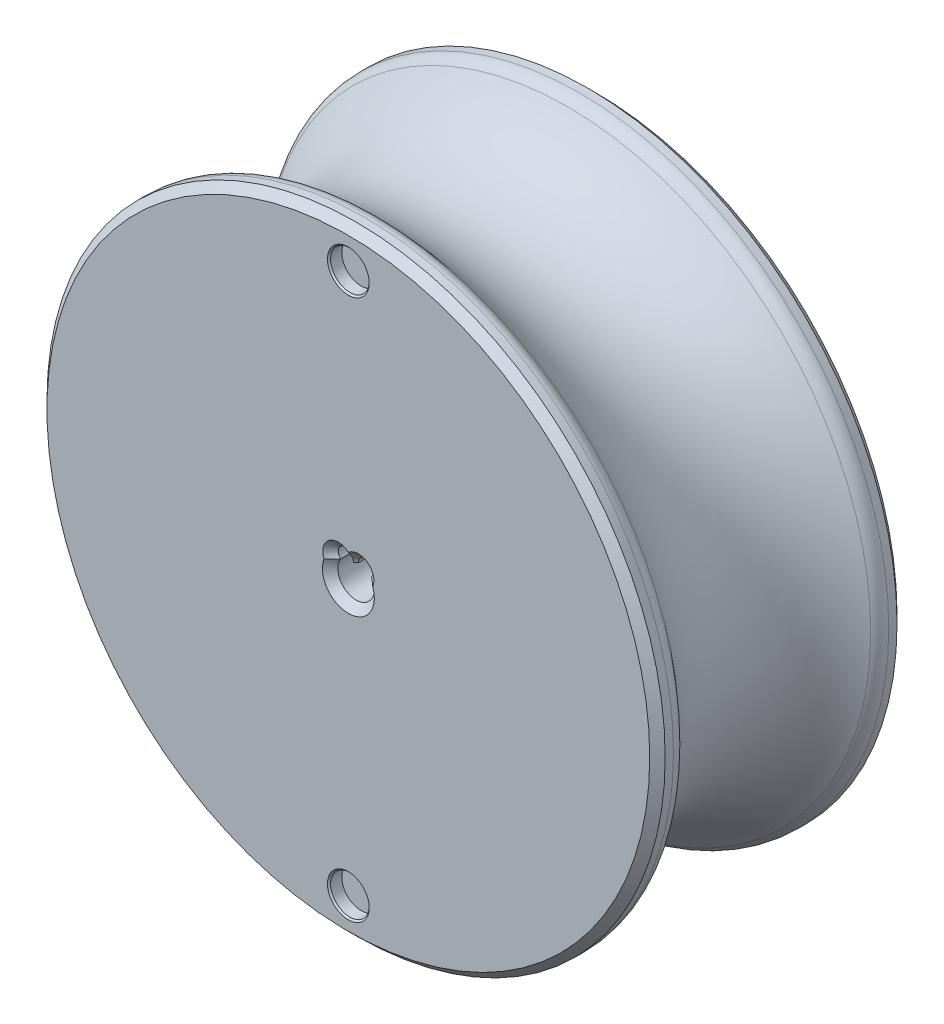
ISO-10303-21;
HEADER;
FILE_DESCRIPTION(('STEP AP214'),'2;1');
FILE_NAME('part.step','',(''),(''),'','','');
FILE_SCHEMA(('AUTOMOTIVE_DESIGN { 1 0 10303 214 1 1 1 1 }'));
ENDSEC;
DATA;
#1=APPLICATION_CONTEXT('core data for automotive mechanical design processes');
#2=APPLICATION_PROTOCOL_DEFINITION('international standard','automotive_design',2000,#1);
#3=PRODUCT_CONTEXT('',#1,'mechanical');
#4=PRODUCT('Part','Part','',(#3));
#5=PRODUCT_RELATED_PRODUCT_CATEGORY('part','',(#4));
#6=PRODUCT_DEFINITION_FORMATION('','',#4);
#7=PRODUCT_DEFINITION_CONTEXT('part definition',#1,'design');
#8=PRODUCT_DEFINITION('design','',#6,#7);
#9=PRODUCT_DEFINITION_SHAPE('','',#8);
#10=(LENGTH_UNIT() NAMED_UNIT(*) SI_UNIT(.MILLI.,.METRE.));
#11=(NAMED_UNIT(*) PLANE_ANGLE_UNIT() SI_UNIT($,.RADIAN.));
#12=(NAMED_UNIT(*) SI_UNIT($,.STERADIAN.) SOLID_ANGLE_UNIT());
#13=UNCERTAINTY_MEASURE_WITH_UNIT(LENGTH_MEASURE(1.E-05),#10,'distance_accuracy_value','');
#14=(GEOMETRIC_REPRESENTATION_CONTEXT(3) GLOBAL_UNCERTAINTY_ASSIGNED_CONTEXT((#13)) GLOBAL_UNIT_ASSIGNED_CONTEXT((#10,
#11,#12)) REPRESENTATION_CONTEXT('',''));
#15=CARTESIAN_POINT('',(0.,0.,0.));
#16=DIRECTION('',(0.,0.,1.));
#17=DIRECTION('',(1.,0.,0.));
#18=AXIS2_PLACEMENT_3D('',#15,#16,#17);
#19=CARTESIAN_POINT('',(0.,0.,20.32));
#20=DIRECTION('',(0.,0.,-1.));
#21=DIRECTION('',(-1.,0.,0.));
#22=AXIS2_PLACEMENT_3D('',#19,#20,#21);
#23=CYLINDRICAL_SURFACE('',#22,50.8);
#24=CARTESIAN_POINT('',(0.,0.,19.05));
#25=DIRECTION('',(0.,0.,1.));
#26=DIRECTION('',(1.,0.,0.));
#27=AXIS2_PLACEMENT_3D('',#24,#25,#26);
#28=CIRCLE('',#27,50.8);
#29=CARTESIAN_POINT('',(50.8,0.,19.05));
#30=VERTEX_POINT('',#29);
#31=EDGE_CURVE('E193',#30,#30,#28,.F.);
#32=ORIENTED_EDGE('',*,*,#31,.T.);
#33=EDGE_LOOP('',(#32));
#34=FACE_BOUND('',#33,.T.);
#35=CARTESIAN_POINT('',(0.,0.,17.6887167426018));
#36=DIRECTION('',(0.,0.,-1.));
#37=DIRECTION('',(-1.,0.,0.));
#38=AXIS2_PLACEMENT_3D('',#35,#36,#37);
#39=CIRCLE('',#38,50.8);
#40=CARTESIAN_POINT('',(-50.8,0.,17.6887167426018));
#41=VERTEX_POINT('',#40);
#42=EDGE_CURVE('E156',#41,#41,#39,.F.);
#43=ORIENTED_EDGE('',*,*,#42,.T.);
#44=EDGE_LOOP('',(#43));
#45=FACE_BOUND('',#44,.T.);
#46=ADVANCED_FACE('F49',(#34,#45),#23,.T.);
#47=CARTESIAN_POINT('',(0.,0.,20.32));
#48=DIRECTION('',(0.,0.,1.));
#49=DIRECTION('',(1.,0.,0.));
#50=AXIS2_PLACEMENT_3D('',#47,#48,#49);
#51=PLANE('',#50);
#52=CARTESIAN_POINT('',(0.,-44.45,20.32));
#53=DIRECTION('',(0.,0.,1.));
#54=DIRECTION('',(1.,0.,0.));
#55=AXIS2_PLACEMENT_3D('',#52,#53,#54);
#56=CIRCLE('',#55,3.42900000000002);
#57=CARTESIAN_POINT('',(3.42900000000002,-44.45,20.32));
#58=VERTEX_POINT('',#57);
#59=EDGE_CURVE('E246',#58,#58,#56,.F.);
#60=ORIENTED_EDGE('',*,*,#59,.T.);
#61=EDGE_LOOP('',(#60));
#62=FACE_BOUND('',#61,.T.);
#63=CARTESIAN_POINT('',(0.,44.45,20.32));
#64=DIRECTION('',(0.,0.,1.));
#65=DIRECTION('',(1.,0.,0.));
#66=AXIS2_PLACEMENT_3D('',#63,#64,#65);
#67=CIRCLE('',#66,3.42899999999999);
#68=CARTESIAN_POINT('',(3.42899999999999,44.45,20.32));
#69=VERTEX_POINT('',#68);
#70=EDGE_CURVE('E242',#69,#69,#67,.F.);
#71=ORIENTED_EDGE('',*,*,#70,.T.);
#72=EDGE_LOOP('',(#71));
#73=FACE_BOUND('',#72,.T.);
#74=CARTESIAN_POINT('',(-1.6583123951777,2.5,20.32));
#75=DIRECTION('',(0.,0.,1.));
#76=DIRECTION('',(1.,0.,0.));
#77=AXIS2_PLACEMENT_3D('',#74,#75,#76);
#78=CIRCLE('',#77,2.54000000000004);
#79=CARTESIAN_POINT('',(-3.99566835496328,1.5058334559789,20.32));
#80=VERTEX_POINT('',#79);
#81=CARTESIAN_POINT('',(0.,4.42395426141065,20.32));
#82=VERTEX_POINT('',#81);
#83=EDGE_CURVE('E74',#80,#82,#78,.F.);
#84=ORIENTED_EDGE('',*,*,#83,.T.);
#85=CARTESIAN_POINT('',(1.6583123951777,2.5,20.32));
#86=DIRECTION('',(0.,0.,1.));
#87=DIRECTION('',(1.,0.,0.));
#88=AXIS2_PLACEMENT_3D('',#85,#86,#87);
#89=CIRCLE('',#88,2.54000000000004);
#90=CARTESIAN_POINT('',(3.99566835496328,1.5058334559789,20.32));
#91=VERTEX_POINT('',#90);
#92=EDGE_CURVE('E178',#82,#91,#89,.F.);
#93=ORIENTED_EDGE('',*,*,#92,.T.);
#94=CARTESIAN_POINT('',(0.,0.,20.32));
#95=DIRECTION('',(0.,0.,1.));
#96=DIRECTION('',(1.,0.,0.));
#97=AXIS2_PLACEMENT_3D('',#94,#95,#96);
#98=CIRCLE('',#97,4.27000000000004);
#99=EDGE_CURVE('E173',#91,#80,#98,.F.);
#100=ORIENTED_EDGE('',*,*,#99,.T.);
#101=EDGE_LOOP('',(#84,#93,#100));
#102=FACE_BOUND('',#101,.T.);
#103=CARTESIAN_POINT('',(0.,0.,20.32));
#104=DIRECTION('',(0.,0.,1.));
#105=DIRECTION('',(1.,0.,0.));
#106=AXIS2_PLACEMENT_3D('',#103,#104,#105);
#107=CIRCLE('',#106,49.53);
#108=CARTESIAN_POINT('',(49.53,0.,20.32));
#109=VERTEX_POINT('',#108);
#110=EDGE_CURVE('E169',#109,#109,#107,.T.);
#111=ORIENTED_EDGE('',*,*,#110,.T.);
#112=EDGE_LOOP('',(#111));
#113=FACE_BOUND('',#112,.T.);
#114=ADVANCED_FACE('F289',(#62,#73,#102,#113),#51,.T.);
#115=CARTESIAN_POINT('',(0.,0.,6.32));
#116=DIRECTION('',(0.,0.,1.));
#117=DIRECTION('',(1.,0.,0.));
#118=AXIS2_PLACEMENT_3D('',#115,#116,#117);
#119=CYLINDRICAL_SURFACE('',#118,3.);
#120=DIRECTION('',(0.,0.,1.));
#121=VECTOR('',#120,1.);
#122=CARTESIAN_POINT('',(-2.54407192027579,1.58987360015325,13.32));
#123=LINE('',#122,#121);
#124=CARTESIAN_POINT('',(-2.54407192027579,1.58987360015325,6.32));
#125=VERTEX_POINT('',#124);
#126=CARTESIAN_POINT('',(-2.54407192027579,1.58987360015325,19.05));
#127=VERTEX_POINT('',#126);
#128=EDGE_CURVE('E136',#125,#127,#123,.T.);
#129=ORIENTED_EDGE('',*,*,#128,.T.);
#130=CARTESIAN_POINT('',(0.,0.,19.05));
#131=DIRECTION('',(0.,0.,1.));
#132=DIRECTION('',(1.,0.,0.));
#133=AXIS2_PLACEMENT_3D('',#130,#131,#132);
#134=CIRCLE('',#133,3.);
#135=CARTESIAN_POINT('',(2.54407192027579,1.58987360015325,19.05));
#136=VERTEX_POINT('',#135);
#137=EDGE_CURVE('E112',#127,#136,#134,.T.);
#138=ORIENTED_EDGE('',*,*,#137,.T.);
#139=DIRECTION('',(0.,0.,1.));
#140=VECTOR('',#139,1.);
#141=CARTESIAN_POINT('',(2.54407192027579,1.58987360015325,13.32));
#142=LINE('',#141,#140);
#143=CARTESIAN_POINT('',(2.54407192027579,1.58987360015325,6.32));
#144=VERTEX_POINT('',#143);
#145=EDGE_CURVE('E106',#136,#144,#142,.F.);
#146=ORIENTED_EDGE('',*,*,#145,.T.);
#147=CARTESIAN_POINT('',(0.,0.,6.32));
#148=DIRECTION('',(0.,0.,1.));
#149=DIRECTION('',(1.,0.,0.));
#150=AXIS2_PLACEMENT_3D('',#147,#148,#149);
#151=CIRCLE('',#150,3.);
#152=EDGE_CURVE('E110',#125,#144,#151,.T.);
#153=ORIENTED_EDGE('',*,*,#152,.F.);
#154=EDGE_LOOP('',(#129,#138,#146,#153));
#155=FACE_BOUND('',#154,.T.);
#156=ADVANCED_FACE('F108',(#155),#119,.F.);
#157=CARTESIAN_POINT('',(-1.6583123951777,2.5,6.32));
#158=DIRECTION('',(0.,1.,0.));
#159=DIRECTION('',(0.,0.,1.));
#160=AXIS2_PLACEMENT_3D('',#157,#158,#159);
#161=PLANE('',#160);
#162=DIRECTION('',(0.,0.,1.));
#163=VECTOR('',#162,1.);
#164=CARTESIAN_POINT('',(0.3883123951777,2.5,6.32));
#165=LINE('',#164,#163);
#166=CARTESIAN_POINT('',(0.3883123951777,2.5,6.32));
#167=VERTEX_POINT('',#166);
#168=CARTESIAN_POINT('',(0.3883123951777,2.5,19.05));
#169=VERTEX_POINT('',#168);
#170=EDGE_CURVE('E118',#167,#169,#165,.T.);
#171=ORIENTED_EDGE('',*,*,#170,.T.);
#172=DIRECTION('',(-0.70710678118655,0.,0.707106781186545));
#173=VECTOR('',#172,1.);
#174=CARTESIAN_POINT('',(1.6583123951777,2.5,17.78));
#175=LINE('',#174,#173);
#176=CARTESIAN_POINT('',(0.,2.5,19.4383123951777));
#177=VERTEX_POINT('',#176);
#178=EDGE_CURVE('E166',#169,#177,#175,.T.);
#179=ORIENTED_EDGE('',*,*,#178,.T.);
#180=DIRECTION('',(-0.70710678118655,0.,-0.707106781186545));
#181=VECTOR('',#180,1.);
#182=CARTESIAN_POINT('',(-1.6583123951777,2.5,17.78));
#183=LINE('',#182,#181);
#184=CARTESIAN_POINT('',(-0.3883123951777,2.5,19.05));
#185=VERTEX_POINT('',#184);
#186=EDGE_CURVE('E163',#177,#185,#183,.T.);
#187=ORIENTED_EDGE('',*,*,#186,.T.);
#188=DIRECTION('',(0.,0.,1.));
#189=VECTOR('',#188,1.);
#190=CARTESIAN_POINT('',(-0.3883123951777,2.5,6.32));
#191=LINE('',#190,#189);
#192=CARTESIAN_POINT('',(-0.3883123951777,2.5,6.32));
#193=VERTEX_POINT('',#192);
#194=EDGE_CURVE('E117',#185,#193,#191,.F.);
#195=ORIENTED_EDGE('',*,*,#194,.T.);
#196=DIRECTION('',(-1.,0.,0.));
#197=VECTOR('',#196,1.);
#198=CARTESIAN_POINT('',(-1.6583123951777,2.5,6.32));
#199=LINE('',#198,#197);
#200=EDGE_CURVE('E135',#167,#193,#199,.T.);
#201=ORIENTED_EDGE('',*,*,#200,.F.);
#202=EDGE_LOOP('',(#171,#179,#187,#195,#201));
#203=FACE_BOUND('',#202,.T.);
#204=ADVANCED_FACE('F397',(#203),#161,.F.);
#205=CARTESIAN_POINT('',(0.,0.,6.32));
#206=DIRECTION('',(0.,0.,1.));
#207=DIRECTION('',(1.,0.,0.));
#208=AXIS2_PLACEMENT_3D('',#205,#206,#207);
#209=PLANE('',#208);
#210=CARTESIAN_POINT('',(-1.6583123951777,2.5,6.32));
#211=DIRECTION('',(0.,0.,1.));
#212=DIRECTION('',(1.,0.,0.));
#213=AXIS2_PLACEMENT_3D('',#210,#211,#212);
#214=CIRCLE('',#213,1.27);
#215=EDGE_CURVE('E128',#193,#125,#214,.T.);
#216=ORIENTED_EDGE('',*,*,#215,.T.);
#217=ORIENTED_EDGE('',*,*,#152,.T.);
#218=CARTESIAN_POINT('',(1.6583123951777,2.5,6.32));
#219=DIRECTION('',(0.,0.,1.));
#220=DIRECTION('',(1.,0.,0.));
#221=AXIS2_PLACEMENT_3D('',#218,#219,#220);
#222=CIRCLE('',#221,1.27);
#223=EDGE_CURVE('E121',#144,#167,#222,.T.);
#224=ORIENTED_EDGE('',*,*,#223,.T.);
#225=ORIENTED_EDGE('',*,*,#200,.T.);
#226=EDGE_LOOP('',(#216,#217,#224,#225));
#227=FACE_BOUND('',#226,.T.);
#228=ADVANCED_FACE('F132',(#227),#209,.T.);
#229=CARTESIAN_POINT('',(1.6583123951777,2.5,6.32));
#230=DIRECTION('',(0.,0.,1.));
#231=DIRECTION('',(1.,0.,0.));
#232=AXIS2_PLACEMENT_3D('',#229,#230,#231);
#233=CYLINDRICAL_SURFACE('',#232,1.27);
#234=ORIENTED_EDGE('',*,*,#145,.F.);
#235=CARTESIAN_POINT('',(1.6583123951777,2.5,19.05));
#236=DIRECTION('',(0.,0.,1.));
#237=DIRECTION('',(1.,0.,0.));
#238=AXIS2_PLACEMENT_3D('',#235,#236,#237);
#239=CIRCLE('',#238,1.27);
#240=EDGE_CURVE('E160',#136,#169,#239,.T.);
#241=ORIENTED_EDGE('',*,*,#240,.T.);
#242=ORIENTED_EDGE('',*,*,#170,.F.);
#243=ORIENTED_EDGE('',*,*,#223,.F.);
#244=EDGE_LOOP('',(#234,#241,#242,#243));
#245=FACE_BOUND('',#244,.T.);
#246=ADVANCED_FACE('F122',(#245),#233,.F.);
#247=CARTESIAN_POINT('',(-1.6583123951777,2.5,6.32));
#248=DIRECTION('',(0.,0.,1.));
#249=DIRECTION('',(1.,0.,0.));
#250=AXIS2_PLACEMENT_3D('',#247,#248,#249);
#251=CYLINDRICAL_SURFACE('',#250,1.27);
#252=ORIENTED_EDGE('',*,*,#194,.F.);
#253=CARTESIAN_POINT('',(-1.6583123951777,2.5,19.05));
#254=DIRECTION('',(0.,0.,1.));
#255=DIRECTION('',(1.,0.,0.));
#256=AXIS2_PLACEMENT_3D('',#253,#254,#255);
#257=CIRCLE('',#256,1.27);
#258=EDGE_CURVE('E66',#185,#127,#257,.T.);
#259=ORIENTED_EDGE('',*,*,#258,.T.);
#260=ORIENTED_EDGE('',*,*,#128,.F.);
#261=ORIENTED_EDGE('',*,*,#215,.F.);
#262=EDGE_LOOP('',(#252,#259,#260,#261));
#263=FACE_BOUND('',#262,.T.);
#264=ADVANCED_FACE('F399',(#263),#251,.F.);
#265=CARTESIAN_POINT('',(0.,0.,0.));
#266=DIRECTION('',(0.,0.,-1.));
#267=DIRECTION('',(-1.,0.,0.));
#268=AXIS2_PLACEMENT_3D('',#265,#266,#267);
#269=TOROIDAL_SURFACE('',#268,62.23,20.);
#270=CARTESIAN_POINT('',(0.,0.,-15.6954008363813));
#271=DIRECTION('',(0.,0.,1.));
#272=DIRECTION('',(1.,0.,0.));
#273=AXIS2_PLACEMENT_3D('',#270,#271,#272);
#274=CIRCLE('',#273,49.8342590949424);
#275=CARTESIAN_POINT('',(49.8342590949424,0.,-15.6954008363813));
#276=VERTEX_POINT('',#275);
#277=EDGE_CURVE('E152',#276,#276,#274,.T.);
#278=ORIENTED_EDGE('',*,*,#277,.T.);
#279=EDGE_LOOP('',(#278));
#280=FACE_BOUND('',#279,.T.);
#281=CARTESIAN_POINT('',(0.,0.,15.6954008363814));
#282=DIRECTION('',(0.,0.,-1.));
#283=DIRECTION('',(-1.,0.,0.));
#284=AXIS2_PLACEMENT_3D('',#281,#282,#283);
#285=CIRCLE('',#284,49.8342590949423);
#286=CARTESIAN_POINT('',(-49.8342590949423,0.,15.6954008363814));
#287=VERTEX_POINT('',#286);
#288=EDGE_CURVE('E148',#287,#287,#285,.T.);
#289=ORIENTED_EDGE('',*,*,#288,.T.);
#290=EDGE_LOOP('',(#289));
#291=FACE_BOUND('',#290,.T.);
#292=ADVANCED_FACE('F314',(#280,#291),#269,.F.);
#293=CARTESIAN_POINT('',(0.,0.,-20.32));
#294=DIRECTION('',(0.,0.,1.));
#295=DIRECTION('',(1.,0.,0.));
#296=AXIS2_PLACEMENT_3D('',#293,#294,#295);
#297=PLANE('',#296);
#298=CARTESIAN_POINT('',(0.,44.45,-20.32));
#299=DIRECTION('',(0.,0.,-1.));
#300=DIRECTION('',(1.,0.,0.));
#301=AXIS2_PLACEMENT_3D('',#298,#299,#300);
#302=CIRCLE('',#301,3.175);
#303=CARTESIAN_POINT('',(3.175,44.45,-20.32));
#304=VERTEX_POINT('',#303);
#305=EDGE_CURVE('E619',#304,#304,#302,.T.);
#306=ORIENTED_EDGE('',*,*,#305,.F.);
#307=EDGE_LOOP('',(#306));
#308=FACE_BOUND('',#307,.T.);
#309=CARTESIAN_POINT('',(0.,-44.45,-20.32));
#310=DIRECTION('',(0.,0.,1.));
#311=DIRECTION('',(1.,0.,0.));
#312=AXIS2_PLACEMENT_3D('',#309,#310,#311);
#313=CIRCLE('',#312,3.175);
#314=CARTESIAN_POINT('',(3.175,-44.45,-20.32));
#315=VERTEX_POINT('',#314);
#316=EDGE_CURVE('E618',#315,#315,#313,.T.);
#317=ORIENTED_EDGE('',*,*,#316,.T.);
#318=EDGE_LOOP('',(#317));
#319=FACE_BOUND('',#318,.T.);
#320=CARTESIAN_POINT('',(0.,0.,-20.32));
#321=DIRECTION('',(0.,0.,1.));
#322=DIRECTION('',(1.,0.,0.));
#323=AXIS2_PLACEMENT_3D('',#320,#321,#322);
#324=CIRCLE('',#323,5.01649999999999);
#325=CARTESIAN_POINT('',(5.01649999999999,0.,-20.32));
#326=VERTEX_POINT('',#325);
#327=EDGE_CURVE('E264',#326,#326,#324,.T.);
#328=ORIENTED_EDGE('',*,*,#327,.T.);
#329=EDGE_LOOP('',(#328));
#330=FACE_BOUND('',#329,.T.);
#331=CARTESIAN_POINT('',(0.,0.,-20.32));
#332=DIRECTION('',(0.,0.,1.));
#333=DIRECTION('',(1.,0.,0.));
#334=AXIS2_PLACEMENT_3D('',#331,#332,#333);
#335=CIRCLE('',#334,49.53);
#336=CARTESIAN_POINT('',(49.53,0.,-20.32));
#337=VERTEX_POINT('',#336);
#338=EDGE_CURVE('E189',#337,#337,#335,.F.);
#339=ORIENTED_EDGE('',*,*,#338,.T.);
#340=EDGE_LOOP('',(#339));
#341=FACE_BOUND('',#340,.T.);
#342=ADVANCED_FACE('F305',(#308,#319,#330,#341),#297,.F.);
#343=CARTESIAN_POINT('',(0.,0.,-19.05));
#344=DIRECTION('',(0.,0.,1.));
#345=DIRECTION('',(1.,0.,0.));
#346=AXIS2_PLACEMENT_3D('',#343,#344,#345);
#347=CIRCLE('',#346,50.8);
#348=CARTESIAN_POINT('',(50.8,0.,-19.05));
#349=VERTEX_POINT('',#348);
#350=EDGE_CURVE('E185',#349,#349,#347,.T.);
#351=ORIENTED_EDGE('',*,*,#350,.T.);
#352=EDGE_LOOP('',(#351));
#353=FACE_BOUND('',#352,.T.);
#354=CARTESIAN_POINT('',(0.,0.,-17.6887167426018));
#355=DIRECTION('',(0.,0.,1.));
#356=DIRECTION('',(1.,0.,0.));
#357=AXIS2_PLACEMENT_3D('',#354,#355,#356);
#358=CIRCLE('',#357,50.8);
#359=CARTESIAN_POINT('',(50.8,0.,-17.6887167426018));
#360=VERTEX_POINT('',#359);
#361=EDGE_CURVE('E140',#360,#360,#358,.F.);
#362=ORIENTED_EDGE('',*,*,#361,.T.);
#363=EDGE_LOOP('',(#362));
#364=FACE_BOUND('',#363,.T.);
#365=ADVANCED_FACE('F292',(#353,#364),#23,.T.);
#366=CARTESIAN_POINT('',(0.,0.,-17.6887167426018));
#367=DIRECTION('',(0.,0.,1.));
#368=DIRECTION('',(1.,0.,0.));
#369=AXIS2_PLACEMENT_3D('',#366,#367,#368);
#370=TOROIDAL_SURFACE('',#369,48.26,2.54);
#371=ORIENTED_EDGE('',*,*,#277,.F.);
#372=EDGE_LOOP('',(#371));
#373=FACE_BOUND('',#372,.T.);
#374=ORIENTED_EDGE('',*,*,#361,.F.);
#375=EDGE_LOOP('',(#374));
#376=FACE_BOUND('',#375,.T.);
#377=ADVANCED_FACE('F304',(#373,#376),#370,.T.);
#378=CARTESIAN_POINT('',(0.,0.,17.6887167426018));
#379=DIRECTION('',(0.,0.,-1.));
#380=DIRECTION('',(-1.,0.,0.));
#381=AXIS2_PLACEMENT_3D('',#378,#379,#380);
#382=TOROIDAL_SURFACE('',#381,48.26,2.54);
#383=ORIENTED_EDGE('',*,*,#288,.F.);
#384=EDGE_LOOP('',(#383));
#385=FACE_BOUND('',#384,.T.);
#386=ORIENTED_EDGE('',*,*,#42,.F.);
#387=EDGE_LOOP('',(#386));
#388=FACE_BOUND('',#387,.T.);
#389=ADVANCED_FACE('F312',(#385,#388),#382,.T.);
#390=CARTESIAN_POINT('',(0.,0.,19.05));
#391=DIRECTION('',(0.,0.,1.));
#392=DIRECTION('',(1.,0.,0.));
#393=AXIS2_PLACEMENT_3D('',#390,#391,#392);
#394=CONICAL_SURFACE('',#393,3.,0.785398163397452);
#395=CARTESIAN_POINT('',(3.99566835496434,1.5058334559793,20.32));
#396=CARTESIAN_POINT('',(3.9366952266943,1.5070657995759,20.2652514389742));
#397=CARTESIAN_POINT('',(3.8776145651639,1.50845254532849,20.2106229250749));
#398=CARTESIAN_POINT('',(3.75919380522037,1.51160043557067,20.1016582496047));
#399=CARTESIAN_POINT('',(3.69985370556045,1.51336158186147,20.0473220894416));
#400=CARTESIAN_POINT('',(3.52146274690504,1.51930219059082,19.8849079764251));
#401=CARTESIAN_POINT('',(3.40195788501056,1.52414038186571,19.7773467542509));
#402=CARTESIAN_POINT('',(3.22134282651098,1.53337636877126,19.6175628095215));
#403=CARTESIAN_POINT('',(3.16088884780077,1.53678644600565,19.5645417747575));
#404=CARTESIAN_POINT('',(3.03944082761305,1.54444240049046,19.4591898260326));
#405=CARTESIAN_POINT('',(2.97844682321115,1.54868822078123,19.4068588652992));
#406=CARTESIAN_POINT('',(2.85574538453356,1.55823780066355,19.3030418905185));
#407=CARTESIAN_POINT('',(2.79403747439427,1.56354230937838,19.2515565028742));
#408=CARTESIAN_POINT('',(2.66975080850791,1.57556172099214,19.1497891098944));
#409=CARTESIAN_POINT('',(2.60717184980855,1.58227695790329,19.0995073926932));
#410=CARTESIAN_POINT('',(2.54407192027579,1.58987360015325,19.05));
#411=B_SPLINE_CURVE_WITH_KNOTS('',3,(#395,#396,#397,#398,#399,#400,#401,#402,#403,#404,#405,
#406,#407,#408,#409,#410),.UNSPECIFIED.,.F.,.F.,(4,2,2,2,2,2,2,4),(0.,0.241433181362463,
0.4828675242669,0.965394497220663,1.20683707632467,1.44826320572009,1.68986077674339,
1.93151561441596),.UNSPECIFIED.);
#412=EDGE_CURVE('E208',#136,#91,#411,.F.);
#413=ORIENTED_EDGE('',*,*,#412,.F.);
#414=ORIENTED_EDGE('',*,*,#137,.F.);
#415=CARTESIAN_POINT('',(-2.54407192027579,1.58987360015325,19.05));
#416=CARTESIAN_POINT('',(-2.59279820582726,1.58399784395606,19.0882161913383));
#417=CARTESIAN_POINT('',(-2.64120948642167,1.57865889062081,19.12690615851));
#418=CARTESIAN_POINT('',(-2.73748756619402,1.5688748219939,19.2050558476824));
#419=CARTESIAN_POINT('',(-2.78535444356544,1.56442957676806,19.2445154568703));
#420=CARTESIAN_POINT('',(-2.88062364552522,1.556253244798,19.3240213927593));
#421=CARTESIAN_POINT('',(-2.92802615423306,1.55252186315603,19.3640674697978));
#422=CARTESIAN_POINT('',(-3.02245724167379,1.54564720600208,19.444651053455));
#423=CARTESIAN_POINT('',(-3.06948580462398,1.54250395518784,19.4851885806353));
#424=CARTESIAN_POINT('',(-3.21001591260294,1.53380667243506,19.607327085479));
#425=CARTESIAN_POINT('',(-3.30304456959861,1.5289783727861,19.6895235165369));
#426=CARTESIAN_POINT('',(-3.48818244779154,1.5206983566464,19.8550243244948));
#427=CARTESIAN_POINT('',(-3.58029157873621,1.5172467740118,19.9383288083157));
#428=CARTESIAN_POINT('',(-3.72620195989311,1.51257228812556,20.0714379291023));
#429=CARTESIAN_POINT('',(-3.78023259202349,1.51101572920727,20.1209802815196));
#430=CARTESIAN_POINT('',(-3.8880947321669,1.50820805236473,20.2203155022461));
#431=CARTESIAN_POINT('',(-3.94192619016018,1.50695700663463,20.2701084269351));
#432=CARTESIAN_POINT('',(-3.99566835496403,1.50583345597774,20.3200000000003));
#433=B_SPLINE_CURVE_WITH_KNOTS('',3,(#415,#416,#417,#418,#419,#420,#421,#422,#423,#424,#425,
#426,#427,#428,#429,#430,#431,#432),.UNSPECIFIED.,.F.,.F.,(4,2,2,2,2,2,2,2,4),(0.,
0.186595822599773,0.373164496809783,0.559655932104369,0.746155197089279,1.11882906569514,
1.49153915999493,1.71150519167064,1.93152315212927),.UNSPECIFIED.);
#434=EDGE_CURVE('E129',#80,#127,#433,.F.);
#435=ORIENTED_EDGE('',*,*,#434,.F.);
#436=ORIENTED_EDGE('',*,*,#99,.F.);
#437=EDGE_LOOP('',(#413,#414,#435,#436));
#438=FACE_BOUND('',#437,.T.);
#439=ADVANCED_FACE('F227',(#438),#394,.F.);
#440=CARTESIAN_POINT('',(-1.6583123951777,2.5,19.05));
#441=DIRECTION('',(0.,0.,1.));
#442=DIRECTION('',(1.,0.,0.));
#443=AXIS2_PLACEMENT_3D('',#440,#441,#442);
#444=CONICAL_SURFACE('',#443,1.27,0.785398163397452);
#445=ORIENTED_EDGE('',*,*,#258,.F.);
#446=ORIENTED_EDGE('',*,*,#186,.F.);
#447=CARTESIAN_POINT('',(0.,10.0079091951533,25.4688686087529));
#448=CARTESIAN_POINT('',(0.,9.82885770338992,25.2940398375524));
#449=CARTESIAN_POINT('',(0.,9.64966889925905,25.1193513100549));
#450=CARTESIAN_POINT('',(0.,9.29071863373352,24.770142904029));
#451=CARTESIAN_POINT('',(0.,9.11095674755227,24.5956234622114));
#452=CARTESIAN_POINT('',(0.,8.74719223868823,24.2433823254672));
#453=CARTESIAN_POINT('',(0.,8.56318000201362,24.0656705538241));
#454=CARTESIAN_POINT('',(0.,8.19476161847601,23.7110880654773));
#455=CARTESIAN_POINT('',(0.,8.01035618560375,23.5342166073796));
#456=CARTESIAN_POINT('',(0.,7.65117004305588,23.1912718357015));
#457=CARTESIAN_POINT('',(0.,7.47643341147247,23.0251523949523));
#458=CARTESIAN_POINT('',(0.,7.12600566800262,22.6939241514078));
#459=CARTESIAN_POINT('',(0.,6.95031456106561,22.5288153433814));
#460=CARTESIAN_POINT('',(0.,6.59677072880661,22.1992088005265));
#461=CARTESIAN_POINT('',(0.,6.41891166608658,22.0347178475261));
#462=CARTESIAN_POINT('',(0.,6.06139155624914,21.707881757431));
#463=CARTESIAN_POINT('',(0.,5.88173144640139,21.5455355967504));
#464=CARTESIAN_POINT('',(0.,5.52314252369557,21.2271207269907));
#465=CARTESIAN_POINT('',(0.,5.3442680290747,21.0709913422774));
#466=CARTESIAN_POINT('',(0.,5.07258967556464,20.8403854867894));
#467=CARTESIAN_POINT('',(0.,4.98137527463757,20.7640396038678));
#468=CARTESIAN_POINT('',(0.,4.79757211966413,20.6130333886356));
#469=CARTESIAN_POINT('',(0.,4.70498350752415,20.538372884266));
#470=CARTESIAN_POINT('',(0.,4.51887248587359,20.3920050560095));
#471=CARTESIAN_POINT('',(0.,4.42536657695612,20.3202768385362));
#472=CARTESIAN_POINT('',(0.,4.23597559762203,20.1799080272948));
#473=CARTESIAN_POINT('',(0.,4.14008942647708,20.1112689049309));
#474=CARTESIAN_POINT('',(0.,3.94554608093612,19.9787583025332));
#475=CARTESIAN_POINT('',(0.,3.84689974269737,19.9148710226344));
#476=CARTESIAN_POINT('',(0.,3.64555044896912,19.7939008434148));
#477=CARTESIAN_POINT('',(0.,3.54285247345419,19.736809917346));
#478=CARTESIAN_POINT('',(0.,3.40479747733694,19.6688768163204));
#479=CARTESIAN_POINT('',(0.,3.37178068274466,19.6532650702829));
#480=CARTESIAN_POINT('',(0.,3.30519848667392,19.6232197090009));
#481=CARTESIAN_POINT('',(0.,3.27163289277818,19.608786518089));
#482=CARTESIAN_POINT('',(0.,3.20395748420655,19.5812778008924));
#483=CARTESIAN_POINT('',(0.,3.16984782629362,19.5682018914003));
#484=CARTESIAN_POINT('',(0.,3.10107956570569,19.5435943351328));
#485=CARTESIAN_POINT('',(0.,3.06642098764738,19.532062619325));
#486=CARTESIAN_POINT('',(0.,2.96398765715831,19.5008014841956));
#487=CARTESIAN_POINT('',(0.,2.89545808578955,19.483450296719));
#488=CARTESIAN_POINT('',(0.,2.75683303350608,19.45671000898));
#489=CARTESIAN_POINT('',(0.,2.68673791574894,19.4473190814767));
#490=CARTESIAN_POINT('',(0.,2.5648047741846,19.4387787617734));
#491=CARTESIAN_POINT('',(0.,2.51310693794945,19.4375595159518));
#492=CARTESIAN_POINT('',(0.,2.40983816034778,19.4399602588021));
#493=CARTESIAN_POINT('',(0.,2.35826718422808,19.4435787277981));
#494=CARTESIAN_POINT('',(0.,2.25490864534748,19.4555277839496));
#495=CARTESIAN_POINT('',(0.,2.20312918792829,19.4639273695803));
#496=CARTESIAN_POINT('',(0.,2.10046334011647,19.4850228168485));
#497=CARTESIAN_POINT('',(0.,2.04957705886724,19.4977191997498));
#498=CARTESIAN_POINT('',(0.,1.92101813182312,19.5348822911811));
#499=CARTESIAN_POINT('',(0.,1.8441059993338,19.5619744043206));
#500=CARTESIAN_POINT('',(0.,1.69294850484912,19.6229682796331));
#501=CARTESIAN_POINT('',(0.,1.61870833396346,19.6568825340945));
#502=CARTESIAN_POINT('',(0.,1.47443136939402,19.7288350104769));
#503=CARTESIAN_POINT('',(0.,1.40433709849756,19.7667599122233));
#504=CARTESIAN_POINT('',(0.,1.26652129606467,19.8460045640068));
#505=CARTESIAN_POINT('',(0.,1.19879015680129,19.8873075112262));
#506=CARTESIAN_POINT('',(0.,1.13189830287777,19.9298144695923));
#507=B_SPLINE_CURVE_WITH_KNOTS('',3,(#447,#448,#449,#450,#451,#452,#453,#454,#455,#456,#457,
#458,#459,#460,#461,#462,#463,#464,#465,#466,#467,#468,#469,#470,#471,#472,#473,#474,#475,#476,
#477,#478,#479,#480,#481,#482,#483,#484,#485,#486,#487,#488,#489,#490,#491,#492,#493,#494,#495,
#496,#497,#498,#499,#500,#501,#502,#503,#504,#505,#506),.UNSPECIFIED.,.F.,.F.,(4,2,2,2,2,2,2,2,
2,2,2,2,2,2,2,2,2,2,2,2,2,2,2,2,2,2,2,2,2,4),(0.,0.750747169359441,1.50237305152878,
2.26982078736438,3.03636947276821,3.75966245155492,4.48295168327332,5.20972735998588,
5.93614265543185,6.64836247181441,7.00519402104295,7.36198897534773,7.71549155588976,
8.0691607729648,8.42159594633938,8.77361066193334,8.88315721610986,8.9927430396172,
9.10229783861284,9.21184773838567,9.42351269551195,9.63512905275846,9.79004782166781,
9.94491793723159,10.1020818697622,10.2592648753895,10.503433405665,10.7480531804747,
10.9870239776996,11.2248710216945),.UNSPECIFIED.);
#508=EDGE_CURVE('E198',#82,#177,#507,.T.);
#509=ORIENTED_EDGE('',*,*,#508,.F.);
#510=ORIENTED_EDGE('',*,*,#83,.F.);
#511=ORIENTED_EDGE('',*,*,#434,.T.);
#512=EDGE_LOOP('',(#445,#446,#509,#510,#511));
#513=FACE_BOUND('',#512,.T.);
#514=ADVANCED_FACE('F221',(#513),#444,.F.);
#515=CARTESIAN_POINT('',(1.6583123951777,2.5,19.05));
#516=DIRECTION('',(0.,0.,1.));
#517=DIRECTION('',(1.,0.,0.));
#518=AXIS2_PLACEMENT_3D('',#515,#516,#517);
#519=CONICAL_SURFACE('',#518,1.27,0.785398163397452);
#520=ORIENTED_EDGE('',*,*,#412,.T.);
#521=ORIENTED_EDGE('',*,*,#92,.F.);
#522=ORIENTED_EDGE('',*,*,#508,.T.);
#523=ORIENTED_EDGE('',*,*,#178,.F.);
#524=ORIENTED_EDGE('',*,*,#240,.F.);
#525=EDGE_LOOP('',(#520,#521,#522,#523,#524));
#526=FACE_BOUND('',#525,.T.);
#527=ADVANCED_FACE('F217',(#526),#519,.F.);
#528=CARTESIAN_POINT('',(0.,0.,-19.05));
#529=DIRECTION('',(0.,0.,1.));
#530=DIRECTION('',(1.,0.,0.));
#531=AXIS2_PLACEMENT_3D('',#528,#529,#530);
#532=CONICAL_SURFACE('',#531,50.8,0.785398163397446);
#533=ORIENTED_EDGE('',*,*,#338,.F.);
#534=EDGE_LOOP('',(#533));
#535=FACE_BOUND('',#534,.T.);
#536=ORIENTED_EDGE('',*,*,#350,.F.);
#537=EDGE_LOOP('',(#536));
#538=FACE_BOUND('',#537,.T.);
#539=ADVANCED_FACE('F321',(#535,#538),#532,.T.);
#540=CARTESIAN_POINT('',(0.,0.,20.32));
#541=DIRECTION('',(0.,0.,-1.));
#542=DIRECTION('',(-1.,0.,0.));
#543=AXIS2_PLACEMENT_3D('',#540,#541,#542);
#544=CONICAL_SURFACE('',#543,49.53,0.785398163397451);
#545=ORIENTED_EDGE('',*,*,#31,.F.);
#546=EDGE_LOOP('',(#545));
#547=FACE_BOUND('',#546,.T.);
#548=ORIENTED_EDGE('',*,*,#110,.F.);
#549=EDGE_LOOP('',(#548));
#550=FACE_BOUND('',#549,.T.);
#551=ADVANCED_FACE('F323',(#547,#550),#544,.T.);
#552=CARTESIAN_POINT('',(0.,-44.45,18.22));
#553=DIRECTION('',(0.,0.,1.));
#554=DIRECTION('',(1.,0.,0.));
#555=AXIS2_PLACEMENT_3D('',#552,#553,#554);
#556=CYLINDRICAL_SURFACE('',#555,3.175);
#557=CARTESIAN_POINT('',(0.,-44.45,20.066));
#558=DIRECTION('',(0.,0.,1.));
#559=DIRECTION('',(1.,0.,0.));
#560=AXIS2_PLACEMENT_3D('',#557,#558,#559);
#561=CIRCLE('',#560,3.175);
#562=CARTESIAN_POINT('',(3.175,-44.45,20.066));
#563=VERTEX_POINT('',#562);
#564=EDGE_CURVE('E197',#563,#563,#561,.T.);
#565=ORIENTED_EDGE('',*,*,#564,.T.);
#566=EDGE_LOOP('',(#565));
#567=FACE_BOUND('',#566,.T.);
#568=CARTESIAN_POINT('',(0.,-44.45,18.22));
#569=DIRECTION('',(0.,0.,1.));
#570=DIRECTION('',(1.,0.,0.));
#571=AXIS2_PLACEMENT_3D('',#568,#569,#570);
#572=CIRCLE('',#571,3.175);
#573=CARTESIAN_POINT('',(3.175,-44.45,18.22));
#574=VERTEX_POINT('',#573);
#575=EDGE_CURVE('E209',#574,#574,#572,.T.);
#576=ORIENTED_EDGE('',*,*,#575,.F.);
#577=EDGE_LOOP('',(#576));
#578=FACE_BOUND('',#577,.T.);
#579=ADVANCED_FACE('F329',(#567,#578),#556,.F.);
#580=CARTESIAN_POINT('',(0.,-44.45,18.22));
#581=DIRECTION('',(0.,0.,1.));
#582=DIRECTION('',(1.,0.,0.));
#583=AXIS2_PLACEMENT_3D('',#580,#581,#582);
#584=PLANE('',#583);
#585=ORIENTED_EDGE('',*,*,#575,.T.);
#586=EDGE_LOOP('',(#585));
#587=FACE_BOUND('',#586,.T.);
#588=ADVANCED_FACE('F379',(#587),#584,.T.);
#589=CARTESIAN_POINT('',(0.,44.45,18.22));
#590=DIRECTION('',(0.,0.,1.));
#591=DIRECTION('',(1.,0.,0.));
#592=AXIS2_PLACEMENT_3D('',#589,#590,#591);
#593=CYLINDRICAL_SURFACE('',#592,3.175);
#594=CARTESIAN_POINT('',(0.,44.45,20.066));
#595=DIRECTION('',(0.,0.,1.));
#596=DIRECTION('',(1.,0.,0.));
#597=AXIS2_PLACEMENT_3D('',#594,#595,#596);
#598=CIRCLE('',#597,3.175);
#599=CARTESIAN_POINT('',(3.175,44.45,20.066));
#600=VERTEX_POINT('',#599);
#601=EDGE_CURVE('E250',#600,#600,#598,.T.);
#602=ORIENTED_EDGE('',*,*,#601,.T.);
#603=EDGE_LOOP('',(#602));
#604=FACE_BOUND('',#603,.T.);
#605=CARTESIAN_POINT('',(0.,44.45,18.22));
#606=DIRECTION('',(0.,0.,-1.));
#607=DIRECTION('',(1.,0.,0.));
#608=AXIS2_PLACEMENT_3D('',#605,#606,#607);
#609=CIRCLE('',#608,3.175);
#610=CARTESIAN_POINT('',(3.175,44.45,18.22));
#611=VERTEX_POINT('',#610);
#612=EDGE_CURVE('E259',#611,#611,#609,.T.);
#613=ORIENTED_EDGE('',*,*,#612,.T.);
#614=EDGE_LOOP('',(#613));
#615=FACE_BOUND('',#614,.T.);
#616=ADVANCED_FACE('F376',(#604,#615),#593,.F.);
#617=CARTESIAN_POINT('',(0.,44.45,18.22));
#618=DIRECTION('',(0.,0.,1.));
#619=DIRECTION('',(1.,0.,0.));
#620=AXIS2_PLACEMENT_3D('',#617,#618,#619);
#621=PLANE('',#620);
#622=ORIENTED_EDGE('',*,*,#612,.F.);
#623=EDGE_LOOP('',(#622));
#624=FACE_BOUND('',#623,.T.);
#625=ADVANCED_FACE('F349',(#624),#621,.T.);
#626=CARTESIAN_POINT('',(0.,-44.45,20.066));
#627=DIRECTION('',(0.,0.,1.));
#628=DIRECTION('',(1.,0.,0.));
#629=AXIS2_PLACEMENT_3D('',#626,#627,#628);
#630=CONICAL_SURFACE('',#629,3.175,0.785398163397445);
#631=ORIENTED_EDGE('',*,*,#59,.F.);
#632=EDGE_LOOP('',(#631));
#633=FACE_BOUND('',#632,.T.);
#634=ORIENTED_EDGE('',*,*,#564,.F.);
#635=EDGE_LOOP('',(#634));
#636=FACE_BOUND('',#635,.T.);
#637=ADVANCED_FACE('F342',(#633,#636),#630,.F.);
#638=CARTESIAN_POINT('',(0.,44.45,20.32));
#639=DIRECTION('',(0.,0.,1.));
#640=DIRECTION('',(1.,0.,0.));
#641=AXIS2_PLACEMENT_3D('',#638,#639,#640);
#642=CONICAL_SURFACE('',#641,3.42899999999999,0.785398163397445);
#643=ORIENTED_EDGE('',*,*,#601,.F.);
#644=EDGE_LOOP('',(#643));
#645=FACE_BOUND('',#644,.T.);
#646=ORIENTED_EDGE('',*,*,#70,.F.);
#647=EDGE_LOOP('',(#646));
#648=FACE_BOUND('',#647,.T.);
#649=ADVANCED_FACE('F348',(#645,#648),#642,.F.);
#650=CARTESIAN_POINT('',(0.,0.,-42.6803841816037));
#651=DIRECTION('',(0.,0.,1.));
#652=DIRECTION('',(1.,0.,0.));
#653=AXIS2_PLACEMENT_3D('',#650,#651,#652);
#654=CYLINDRICAL_SURFACE('',#653,4.7625);
#655=CARTESIAN_POINT('',(0.,0.,-20.574));
#656=DIRECTION('',(0.,0.,1.));
#657=DIRECTION('',(1.,0.,0.));
#658=AXIS2_PLACEMENT_3D('',#655,#656,#657);
#659=CIRCLE('',#658,4.7625);
#660=CARTESIAN_POINT('',(4.7625,0.,-20.574));
#661=VERTEX_POINT('',#660);
#662=EDGE_CURVE('E254',#661,#661,#659,.F.);
#663=ORIENTED_EDGE('',*,*,#662,.T.);
#664=EDGE_LOOP('',(#663));
#665=FACE_BOUND('',#664,.T.);
#666=CARTESIAN_POINT('',(0.,0.,-21.21));
#667=DIRECTION('',(0.,0.,-1.));
#668=DIRECTION('',(-1.,0.,0.));
#669=AXIS2_PLACEMENT_3D('',#666,#667,#668);
#670=CIRCLE('',#669,4.7625);
#671=CARTESIAN_POINT('',(-4.7625,0.,-21.21));
#672=VERTEX_POINT('',#671);
#673=EDGE_CURVE('E260',#672,#672,#670,.T.);
#674=ORIENTED_EDGE('',*,*,#673,.F.);
#675=EDGE_LOOP('',(#674));
#676=FACE_BOUND('',#675,.T.);
#677=ADVANCED_FACE('F355',(#665,#676),#654,.T.);
#678=CARTESIAN_POINT('',(0.,0.,-21.21));
#679=DIRECTION('',(0.,0.,-1.));
#680=DIRECTION('',(-1.,0.,0.));
#681=AXIS2_PLACEMENT_3D('',#678,#679,#680);
#682=PLANE('',#681);
#683=CARTESIAN_POINT('',(0.,0.,-21.21));
#684=DIRECTION('',(0.,0.,-1.));
#685=DIRECTION('',(-1.,0.,0.));
#686=AXIS2_PLACEMENT_3D('',#683,#684,#685);
#687=CIRCLE('',#686,3.95);
#688=CARTESIAN_POINT('',(-3.95,0.,-21.21));
#689=VERTEX_POINT('',#688);
#690=EDGE_CURVE('E255',#689,#689,#687,.T.);
#691=ORIENTED_EDGE('',*,*,#690,.F.);
#692=EDGE_LOOP('',(#691));
#693=FACE_BOUND('',#692,.T.);
#694=ORIENTED_EDGE('',*,*,#673,.T.);
#695=EDGE_LOOP('',(#694));
#696=FACE_BOUND('',#695,.T.);
#697=ADVANCED_FACE('F365',(#693,#696),#682,.T.);
#698=CARTESIAN_POINT('',(0.,0.,-29.21));
#699=DIRECTION('',(0.,0.,-1.));
#700=DIRECTION('',(-1.,0.,0.));
#701=AXIS2_PLACEMENT_3D('',#698,#699,#700);
#702=PLANE('',#701);
#703=CARTESIAN_POINT('',(0.,0.,-29.21));
#704=DIRECTION('',(0.,0.,-1.));
#705=DIRECTION('',(-1.,0.,0.));
#706=AXIS2_PLACEMENT_3D('',#703,#704,#705);
#707=CIRCLE('',#706,3.69599999999999);
#708=CARTESIAN_POINT('',(-3.69599999999999,0.,-29.21));
#709=VERTEX_POINT('',#708);
#710=EDGE_CURVE('E59',#709,#709,#707,.T.);
#711=ORIENTED_EDGE('',*,*,#710,.T.);
#712=EDGE_LOOP('',(#711));
#713=FACE_BOUND('',#712,.T.);
#714=ADVANCED_FACE('F271',(#713),#702,.T.);
#715=CARTESIAN_POINT('',(0.,0.,-29.21));
#716=DIRECTION('',(0.,0.,1.));
#717=DIRECTION('',(1.,0.,0.));
#718=AXIS2_PLACEMENT_3D('',#715,#716,#717);
#719=CYLINDRICAL_SURFACE('',#718,3.95);
#720=CARTESIAN_POINT('',(0.,0.,-28.956));
#721=DIRECTION('',(0.,0.,-1.));
#722=DIRECTION('',(-1.,0.,0.));
#723=AXIS2_PLACEMENT_3D('',#720,#721,#722);
#724=CIRCLE('',#723,3.95);
#725=CARTESIAN_POINT('',(-3.95,0.,-28.956));
#726=VERTEX_POINT('',#725);
#727=EDGE_CURVE('E12',#726,#726,#724,.F.);
#728=ORIENTED_EDGE('',*,*,#727,.T.);
#729=EDGE_LOOP('',(#728));
#730=FACE_BOUND('',#729,.T.);
#731=ORIENTED_EDGE('',*,*,#690,.T.);
#732=EDGE_LOOP('',(#731));
#733=FACE_BOUND('',#732,.T.);
#734=ADVANCED_FACE('F285',(#730,#733),#719,.T.);
#735=CARTESIAN_POINT('',(0.,0.,-20.574));
#736=DIRECTION('',(0.,0.,1.));
#737=DIRECTION('',(1.,0.,0.));
#738=AXIS2_PLACEMENT_3D('',#735,#736,#737);
#739=CONICAL_SURFACE('',#738,4.7625,0.785398163397481);
#740=ORIENTED_EDGE('',*,*,#327,.F.);
#741=EDGE_LOOP('',(#740));
#742=FACE_BOUND('',#741,.T.);
#743=ORIENTED_EDGE('',*,*,#662,.F.);
#744=EDGE_LOOP('',(#743));
#745=FACE_BOUND('',#744,.T.);
#746=ADVANCED_FACE('F275',(#742,#745),#739,.T.);
#747=CARTESIAN_POINT('',(0.,0.,-29.21));
#748=DIRECTION('',(0.,0.,1.));
#749=DIRECTION('',(1.,0.,0.));
#750=AXIS2_PLACEMENT_3D('',#747,#748,#749);
#751=CONICAL_SURFACE('',#750,3.69599999999999,0.785398163397472);
#752=ORIENTED_EDGE('',*,*,#727,.F.);
#753=EDGE_LOOP('',(#752));
#754=FACE_BOUND('',#753,.T.);
#755=ORIENTED_EDGE('',*,*,#710,.F.);
#756=EDGE_LOOP('',(#755));
#757=FACE_BOUND('',#756,.T.);
#758=ADVANCED_FACE('F52',(#754,#757),#751,.T.);
#759=CARTESIAN_POINT('',(0.,-44.45,-18.22));
#760=DIRECTION('',(0.,0.,-1.));
#761=DIRECTION('',(-1.,0.,0.));
#762=AXIS2_PLACEMENT_3D('',#759,#760,#761);
#763=CYLINDRICAL_SURFACE('',#762,3.175);
#764=CARTESIAN_POINT('',(0.,-44.45,-18.22));
#765=DIRECTION('',(0.,0.,1.));
#766=DIRECTION('',(1.,0.,0.));
#767=AXIS2_PLACEMENT_3D('',#764,#765,#766);
#768=CIRCLE('',#767,3.175);
#769=CARTESIAN_POINT('',(3.175,-44.45,-18.22));
#770=VERTEX_POINT('',#769);
#771=EDGE_CURVE('E624',#770,#770,#768,.T.);
#772=ORIENTED_EDGE('',*,*,#771,.T.);
#773=EDGE_LOOP('',(#772));
#774=FACE_BOUND('',#773,.T.);
#775=ORIENTED_EDGE('',*,*,#316,.F.);
#776=EDGE_LOOP('',(#775));
#777=FACE_BOUND('',#776,.T.);
#778=ADVANCED_FACE('F274',(#774,#777),#763,.F.);
#779=CARTESIAN_POINT('',(0.,-44.45,-18.22));
#780=DIRECTION('',(0.,0.,-1.));
#781=DIRECTION('',(1.,0.,0.));
#782=AXIS2_PLACEMENT_3D('',#779,#780,#781);
#783=PLANE('',#782);
#784=ORIENTED_EDGE('',*,*,#771,.F.);
#785=EDGE_LOOP('',(#784));
#786=FACE_BOUND('',#785,.T.);
#787=ADVANCED_FACE('F282',(#786),#783,.T.);
#788=CARTESIAN_POINT('',(0.,44.45,-18.22));
#789=DIRECTION('',(0.,0.,-1.));
#790=DIRECTION('',(-1.,0.,0.));
#791=AXIS2_PLACEMENT_3D('',#788,#789,#790);
#792=CYLINDRICAL_SURFACE('',#791,3.175);
#793=CARTESIAN_POINT('',(0.,44.45,-18.22));
#794=DIRECTION('',(0.,0.,-1.));
#795=DIRECTION('',(1.,0.,0.));
#796=AXIS2_PLACEMENT_3D('',#793,#794,#795);
#797=CIRCLE('',#796,3.175);
#798=CARTESIAN_POINT('',(3.175,44.45,-18.22));
#799=VERTEX_POINT('',#798);
#800=EDGE_CURVE('E616',#799,#799,#797,.T.);
#801=ORIENTED_EDGE('',*,*,#800,.F.);
#802=EDGE_LOOP('',(#801));
#803=FACE_BOUND('',#802,.T.);
#804=ORIENTED_EDGE('',*,*,#305,.T.);
#805=EDGE_LOOP('',(#804));
#806=FACE_BOUND('',#805,.T.);
#807=ADVANCED_FACE('F591',(#803,#806),#792,.F.);
#808=CARTESIAN_POINT('',(0.,44.45,-18.22));
#809=DIRECTION('',(0.,0.,-1.));
#810=DIRECTION('',(1.,0.,0.));
#811=AXIS2_PLACEMENT_3D('',#808,#809,#810);
#812=PLANE('',#811);
#813=ORIENTED_EDGE('',*,*,#800,.T.);
#814=EDGE_LOOP('',(#813));
#815=FACE_BOUND('',#814,.T.);
#816=ADVANCED_FACE('F601',(#815),#812,.T.);
#817=CLOSED_SHELL('',(#46,#114,#156,#204,#228,#246,#264,#292,#342,#365,#377,#389,#439,#514,#527,
#539,#551,#579,#588,#616,#625,#637,#649,#677,#697,#714,#734,#746,#758,#778,#787,#807,#816));
#818=MANIFOLD_SOLID_BREP('B2',#817);
#819=ADVANCED_BREP_SHAPE_REPRESENTATION('',(#18,#818),#14);
#820=SHAPE_DEFINITION_REPRESENTATION(#9,#819);
ENDSEC;
END-ISO-10303-21;
